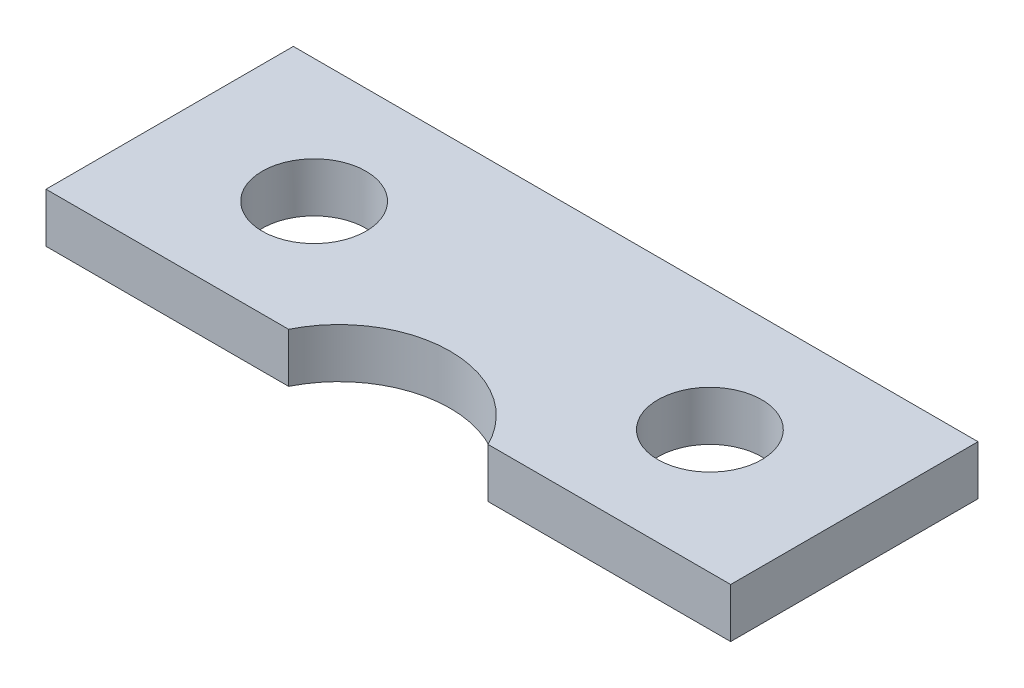
ISO-10303-21;
HEADER;
FILE_DESCRIPTION(('STEP AP214'),'2;1');
FILE_NAME('part.step','',(''),(''),'','','');
FILE_SCHEMA(('AUTOMOTIVE_DESIGN { 1 0 10303 214 1 1 1 1 }'));
ENDSEC;
DATA;
#1=APPLICATION_CONTEXT('core data for automotive mechanical design processes');
#2=APPLICATION_PROTOCOL_DEFINITION('international standard','automotive_design',2000,#1);
#3=PRODUCT_CONTEXT('',#1,'mechanical');
#4=PRODUCT('Part','Part','',(#3));
#5=PRODUCT_RELATED_PRODUCT_CATEGORY('part','',(#4));
#6=PRODUCT_DEFINITION_FORMATION('','',#4);
#7=PRODUCT_DEFINITION_CONTEXT('part definition',#1,'design');
#8=PRODUCT_DEFINITION('design','',#6,#7);
#9=PRODUCT_DEFINITION_SHAPE('','',#8);
#10=(LENGTH_UNIT() NAMED_UNIT(*) SI_UNIT(.MILLI.,.METRE.));
#11=(NAMED_UNIT(*) PLANE_ANGLE_UNIT() SI_UNIT($,.RADIAN.));
#12=(NAMED_UNIT(*) SI_UNIT($,.STERADIAN.) SOLID_ANGLE_UNIT());
#13=UNCERTAINTY_MEASURE_WITH_UNIT(LENGTH_MEASURE(1.E-05),#10,'distance_accuracy_value','');
#14=(GEOMETRIC_REPRESENTATION_CONTEXT(3) GLOBAL_UNCERTAINTY_ASSIGNED_CONTEXT((#13)) GLOBAL_UNIT_ASSIGNED_CONTEXT((#10,
#11,#12)) REPRESENTATION_CONTEXT('',''));
#15=CARTESIAN_POINT('',(0.,0.,0.));
#16=DIRECTION('',(0.,0.,1.));
#17=DIRECTION('',(1.,0.,0.));
#18=AXIS2_PLACEMENT_3D('',#15,#16,#17);
#19=CARTESIAN_POINT('',(-13.84,2.,5.));
#20=DIRECTION('',(0.,0.,-1.));
#21=DIRECTION('',(-1.,0.,0.));
#22=AXIS2_PLACEMENT_3D('',#19,#20,#21);
#23=PLANE('',#22);
#24=DIRECTION('',(1.,0.,0.));
#25=VECTOR('',#24,1.);
#26=CARTESIAN_POINT('',(-13.84,2.,5.));
#27=LINE('',#26,#25);
#28=CARTESIAN_POINT('',(4.03112887414927,2.,5.));
#29=VERTEX_POINT('',#28);
#30=CARTESIAN_POINT('',(13.84,2.,5.));
#31=VERTEX_POINT('',#30);
#32=EDGE_CURVE('E58',#29,#31,#27,.T.);
#33=ORIENTED_EDGE('',*,*,#32,.F.);
#34=DIRECTION('',(0.,-1.,0.));
#35=VECTOR('',#34,1.);
#36=CARTESIAN_POINT('',(4.03112887414927,2.001,5.));
#37=LINE('',#36,#35);
#38=CARTESIAN_POINT('',(4.03112887414927,0.,5.));
#39=VERTEX_POINT('',#38);
#40=EDGE_CURVE('E96',#39,#29,#37,.F.);
#41=ORIENTED_EDGE('',*,*,#40,.F.);
#42=DIRECTION('',(1.,0.,0.));
#43=VECTOR('',#42,1.);
#44=CARTESIAN_POINT('',(-13.84,0.,5.));
#45=LINE('',#44,#43);
#46=CARTESIAN_POINT('',(13.84,0.,5.));
#47=VERTEX_POINT('',#46);
#48=EDGE_CURVE('E80',#39,#47,#45,.T.);
#49=ORIENTED_EDGE('',*,*,#48,.T.);
#50=DIRECTION('',(0.,-1.,0.));
#51=VECTOR('',#50,1.);
#52=CARTESIAN_POINT('',(13.84,2.,5.));
#53=LINE('',#52,#51);
#54=EDGE_CURVE('E115',#31,#47,#53,.T.);
#55=ORIENTED_EDGE('',*,*,#54,.F.);
#56=EDGE_LOOP('',(#33,#41,#49,#55));
#57=FACE_BOUND('',#56,.T.);
#58=ADVANCED_FACE('F34',(#57),#23,.F.);
#59=CARTESIAN_POINT('',(13.84,2.,-5.));
#60=DIRECTION('',(-1.,0.,0.));
#61=DIRECTION('',(0.,0.,1.));
#62=AXIS2_PLACEMENT_3D('',#59,#60,#61);
#63=PLANE('',#62);
#64=DIRECTION('',(0.,0.,-1.));
#65=VECTOR('',#64,1.);
#66=CARTESIAN_POINT('',(13.84,0.,-5.));
#67=LINE('',#66,#65);
#68=CARTESIAN_POINT('',(13.84,0.,-5.));
#69=VERTEX_POINT('',#68);
#70=EDGE_CURVE('E106',#47,#69,#67,.T.);
#71=ORIENTED_EDGE('',*,*,#70,.T.);
#72=DIRECTION('',(0.,-1.,0.));
#73=VECTOR('',#72,1.);
#74=CARTESIAN_POINT('',(13.84,2.,-5.));
#75=LINE('',#74,#73);
#76=CARTESIAN_POINT('',(13.84,2.,-5.));
#77=VERTEX_POINT('',#76);
#78=EDGE_CURVE('E11',#77,#69,#75,.T.);
#79=ORIENTED_EDGE('',*,*,#78,.F.);
#80=DIRECTION('',(0.,0.,-1.));
#81=VECTOR('',#80,1.);
#82=CARTESIAN_POINT('',(13.84,2.,-5.));
#83=LINE('',#82,#81);
#84=EDGE_CURVE('E110',#31,#77,#83,.T.);
#85=ORIENTED_EDGE('',*,*,#84,.F.);
#86=ORIENTED_EDGE('',*,*,#54,.T.);
#87=EDGE_LOOP('',(#71,#79,#85,#86));
#88=FACE_BOUND('',#87,.T.);
#89=ADVANCED_FACE('F36',(#88),#63,.F.);
#90=CARTESIAN_POINT('',(-13.84,2.,-5.));
#91=DIRECTION('',(0.,0.,1.));
#92=DIRECTION('',(1.,0.,0.));
#93=AXIS2_PLACEMENT_3D('',#90,#91,#92);
#94=PLANE('',#93);
#95=DIRECTION('',(-1.,0.,0.));
#96=VECTOR('',#95,1.);
#97=CARTESIAN_POINT('',(-13.84,0.,-5.));
#98=LINE('',#97,#96);
#99=CARTESIAN_POINT('',(-13.84,0.,-5.));
#100=VERTEX_POINT('',#99);
#101=EDGE_CURVE('E111',#69,#100,#98,.T.);
#102=ORIENTED_EDGE('',*,*,#101,.T.);
#103=DIRECTION('',(0.,-1.,0.));
#104=VECTOR('',#103,1.);
#105=CARTESIAN_POINT('',(-13.84,2.,-5.));
#106=LINE('',#105,#104);
#107=CARTESIAN_POINT('',(-13.84,2.,-5.));
#108=VERTEX_POINT('',#107);
#109=EDGE_CURVE('E42',#108,#100,#106,.T.);
#110=ORIENTED_EDGE('',*,*,#109,.F.);
#111=DIRECTION('',(-1.,0.,0.));
#112=VECTOR('',#111,1.);
#113=CARTESIAN_POINT('',(-13.84,2.,-5.));
#114=LINE('',#113,#112);
#115=EDGE_CURVE('E87',#77,#108,#114,.T.);
#116=ORIENTED_EDGE('',*,*,#115,.F.);
#117=ORIENTED_EDGE('',*,*,#78,.T.);
#118=EDGE_LOOP('',(#102,#110,#116,#117));
#119=FACE_BOUND('',#118,.T.);
#120=ADVANCED_FACE('F136',(#119),#94,.F.);
#121=CARTESIAN_POINT('',(-13.84,2.,-5.));
#122=DIRECTION('',(1.,0.,0.));
#123=DIRECTION('',(0.,0.,-1.));
#124=AXIS2_PLACEMENT_3D('',#121,#122,#123);
#125=PLANE('',#124);
#126=DIRECTION('',(0.,0.,1.));
#127=VECTOR('',#126,1.);
#128=CARTESIAN_POINT('',(-13.84,0.,-5.));
#129=LINE('',#128,#127);
#130=CARTESIAN_POINT('',(-13.84,0.,5.));
#131=VERTEX_POINT('',#130);
#132=EDGE_CURVE('E108',#100,#131,#129,.T.);
#133=ORIENTED_EDGE('',*,*,#132,.T.);
#134=DIRECTION('',(0.,-1.,0.));
#135=VECTOR('',#134,1.);
#136=CARTESIAN_POINT('',(-13.84,2.,5.));
#137=LINE('',#136,#135);
#138=CARTESIAN_POINT('',(-13.84,2.,5.));
#139=VERTEX_POINT('',#138);
#140=EDGE_CURVE('E117',#139,#131,#137,.T.);
#141=ORIENTED_EDGE('',*,*,#140,.F.);
#142=DIRECTION('',(0.,0.,1.));
#143=VECTOR('',#142,1.);
#144=CARTESIAN_POINT('',(-13.84,2.,-5.));
#145=LINE('',#144,#143);
#146=EDGE_CURVE('E126',#108,#139,#145,.T.);
#147=ORIENTED_EDGE('',*,*,#146,.F.);
#148=ORIENTED_EDGE('',*,*,#109,.T.);
#149=EDGE_LOOP('',(#133,#141,#147,#148));
#150=FACE_BOUND('',#149,.T.);
#151=ADVANCED_FACE('F124',(#150),#125,.F.);
#152=CARTESIAN_POINT('',(-4.03112887414927,0.,5.));
#153=VERTEX_POINT('',#152);
#154=EDGE_CURVE('E107',#131,#153,#45,.T.);
#155=ORIENTED_EDGE('',*,*,#154,.T.);
#156=DIRECTION('',(0.,-1.,0.));
#157=VECTOR('',#156,1.);
#158=CARTESIAN_POINT('',(-4.03112887414927,2.001,5.));
#159=LINE('',#158,#157);
#160=CARTESIAN_POINT('',(-4.03112887414927,2.,5.));
#161=VERTEX_POINT('',#160);
#162=EDGE_CURVE('E49',#161,#153,#159,.T.);
#163=ORIENTED_EDGE('',*,*,#162,.F.);
#164=EDGE_CURVE('E118',#139,#161,#27,.T.);
#165=ORIENTED_EDGE('',*,*,#164,.F.);
#166=ORIENTED_EDGE('',*,*,#140,.T.);
#167=EDGE_LOOP('',(#155,#163,#165,#166));
#168=FACE_BOUND('',#167,.T.);
#169=ADVANCED_FACE('F128',(#168),#23,.F.);
#170=CARTESIAN_POINT('',(0.,2.,0.));
#171=DIRECTION('',(0.,1.,0.));
#172=DIRECTION('',(0.,0.,1.));
#173=AXIS2_PLACEMENT_3D('',#170,#171,#172);
#174=PLANE('',#173);
#175=CARTESIAN_POINT('',(0.,2.,7.));
#176=DIRECTION('',(0.,1.,0.));
#177=DIRECTION('',(0.,0.,1.));
#178=AXIS2_PLACEMENT_3D('',#175,#176,#177);
#179=CIRCLE('',#178,4.5);
#180=EDGE_CURVE('E100',#161,#29,#179,.F.);
#181=ORIENTED_EDGE('',*,*,#180,.T.);
#182=ORIENTED_EDGE('',*,*,#32,.T.);
#183=ORIENTED_EDGE('',*,*,#84,.T.);
#184=ORIENTED_EDGE('',*,*,#115,.T.);
#185=ORIENTED_EDGE('',*,*,#146,.T.);
#186=ORIENTED_EDGE('',*,*,#164,.T.);
#187=EDGE_LOOP('',(#181,#182,#183,#184,#185,#186));
#188=FACE_BOUND('',#187,.T.);
#189=CARTESIAN_POINT('',(8.,2.,0.));
#190=DIRECTION('',(0.,1.,0.));
#191=DIRECTION('',(0.,0.,1.));
#192=AXIS2_PLACEMENT_3D('',#189,#190,#191);
#193=CIRCLE('',#192,2.1);
#194=CARTESIAN_POINT('',(8.,2.,2.1));
#195=VERTEX_POINT('',#194);
#196=EDGE_CURVE('E145',#195,#195,#193,.T.);
#197=ORIENTED_EDGE('',*,*,#196,.F.);
#198=EDGE_LOOP('',(#197));
#199=FACE_BOUND('',#198,.T.);
#200=CARTESIAN_POINT('',(-8.,2.,0.));
#201=DIRECTION('',(0.,1.,0.));
#202=DIRECTION('',(0.,0.,-1.));
#203=AXIS2_PLACEMENT_3D('',#200,#201,#202);
#204=CIRCLE('',#203,2.1);
#205=CARTESIAN_POINT('',(-8.,2.,-2.1));
#206=VERTEX_POINT('',#205);
#207=EDGE_CURVE('E146',#206,#206,#204,.T.);
#208=ORIENTED_EDGE('',*,*,#207,.F.);
#209=EDGE_LOOP('',(#208));
#210=FACE_BOUND('',#209,.T.);
#211=ADVANCED_FACE('F154',(#188,#199,#210),#174,.T.);
#212=CARTESIAN_POINT('',(0.,0.,0.));
#213=DIRECTION('',(0.,1.,0.));
#214=DIRECTION('',(0.,0.,1.));
#215=AXIS2_PLACEMENT_3D('',#212,#213,#214);
#216=PLANE('',#215);
#217=CARTESIAN_POINT('',(8.,0.,0.));
#218=DIRECTION('',(0.,1.,0.));
#219=DIRECTION('',(0.,0.,1.));
#220=AXIS2_PLACEMENT_3D('',#217,#218,#219);
#221=CIRCLE('',#220,2.1);
#222=CARTESIAN_POINT('',(8.,0.,2.1));
#223=VERTEX_POINT('',#222);
#224=EDGE_CURVE('E135',#223,#223,#221,.F.);
#225=ORIENTED_EDGE('',*,*,#224,.F.);
#226=EDGE_LOOP('',(#225));
#227=FACE_BOUND('',#226,.T.);
#228=CARTESIAN_POINT('',(-8.,0.,0.));
#229=DIRECTION('',(0.,1.,0.));
#230=DIRECTION('',(0.,0.,1.));
#231=AXIS2_PLACEMENT_3D('',#228,#229,#230);
#232=CIRCLE('',#231,2.1);
#233=CARTESIAN_POINT('',(-8.,0.,2.1));
#234=VERTEX_POINT('',#233);
#235=EDGE_CURVE('E142',#234,#234,#232,.F.);
#236=ORIENTED_EDGE('',*,*,#235,.F.);
#237=EDGE_LOOP('',(#236));
#238=FACE_BOUND('',#237,.T.);
#239=ORIENTED_EDGE('',*,*,#48,.F.);
#240=CARTESIAN_POINT('',(0.,0.,7.));
#241=DIRECTION('',(0.,-1.,0.));
#242=DIRECTION('',(0.,0.,-1.));
#243=AXIS2_PLACEMENT_3D('',#240,#241,#242);
#244=CIRCLE('',#243,4.5);
#245=EDGE_CURVE('E94',#153,#39,#244,.T.);
#246=ORIENTED_EDGE('',*,*,#245,.F.);
#247=ORIENTED_EDGE('',*,*,#154,.F.);
#248=ORIENTED_EDGE('',*,*,#132,.F.);
#249=ORIENTED_EDGE('',*,*,#101,.F.);
#250=ORIENTED_EDGE('',*,*,#70,.F.);
#251=EDGE_LOOP('',(#239,#246,#247,#248,#249,#250));
#252=FACE_BOUND('',#251,.T.);
#253=ADVANCED_FACE('F104',(#227,#238,#252),#216,.F.);
#254=CARTESIAN_POINT('',(-8.,-0.00100000000000013,0.));
#255=DIRECTION('',(0.,1.,0.));
#256=DIRECTION('',(0.,0.,1.));
#257=AXIS2_PLACEMENT_3D('',#254,#255,#256);
#258=CYLINDRICAL_SURFACE('',#257,2.1);
#259=ORIENTED_EDGE('',*,*,#207,.T.);
#260=EDGE_LOOP('',(#259));
#261=FACE_BOUND('',#260,.T.);
#262=ORIENTED_EDGE('',*,*,#235,.T.);
#263=EDGE_LOOP('',(#262));
#264=FACE_BOUND('',#263,.T.);
#265=ADVANCED_FACE('F162',(#261,#264),#258,.F.);
#266=CARTESIAN_POINT('',(8.,-0.00100000000000013,0.));
#267=DIRECTION('',(0.,1.,0.));
#268=DIRECTION('',(0.,0.,1.));
#269=AXIS2_PLACEMENT_3D('',#266,#267,#268);
#270=CYLINDRICAL_SURFACE('',#269,2.1);
#271=ORIENTED_EDGE('',*,*,#196,.T.);
#272=EDGE_LOOP('',(#271));
#273=FACE_BOUND('',#272,.T.);
#274=ORIENTED_EDGE('',*,*,#224,.T.);
#275=EDGE_LOOP('',(#274));
#276=FACE_BOUND('',#275,.T.);
#277=ADVANCED_FACE('F165',(#273,#276),#270,.F.);
#278=CARTESIAN_POINT('',(0.,2.001,7.));
#279=DIRECTION('',(0.,-1.,0.));
#280=DIRECTION('',(0.,0.,-1.));
#281=AXIS2_PLACEMENT_3D('',#278,#279,#280);
#282=CYLINDRICAL_SURFACE('',#281,4.5);
#283=ORIENTED_EDGE('',*,*,#40,.T.);
#284=ORIENTED_EDGE('',*,*,#180,.F.);
#285=ORIENTED_EDGE('',*,*,#162,.T.);
#286=ORIENTED_EDGE('',*,*,#245,.T.);
#287=EDGE_LOOP('',(#283,#284,#285,#286));
#288=FACE_BOUND('',#287,.T.);
#289=ADVANCED_FACE('F95',(#288),#282,.F.);
#290=CLOSED_SHELL('',(#58,#89,#120,#151,#169,#211,#253,#265,#277,#289));
#291=MANIFOLD_SOLID_BREP('B2',#290);
#292=ADVANCED_BREP_SHAPE_REPRESENTATION('',(#18,#291),#14);
#293=SHAPE_DEFINITION_REPRESENTATION(#9,#292);
ENDSEC;
END-ISO-10303-21;
